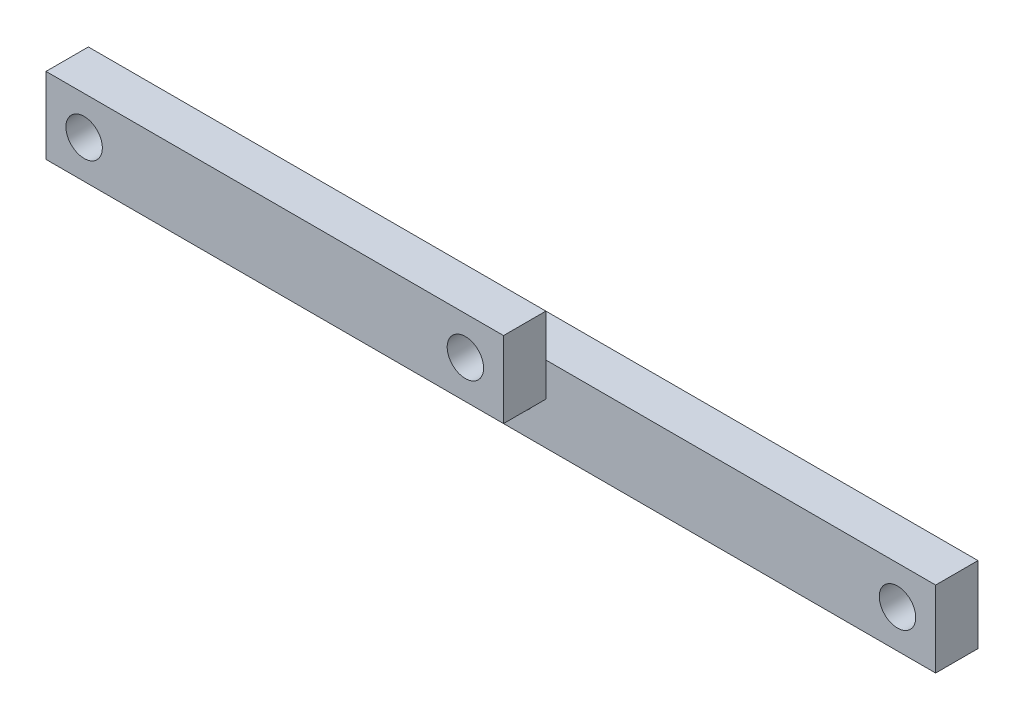
ISO-10303-21;
HEADER;
FILE_DESCRIPTION(('STEP AP214'),'2;1');
FILE_NAME('part.step','',(''),(''),'','','');
FILE_SCHEMA(('AUTOMOTIVE_DESIGN { 1 0 10303 214 1 1 1 1 }'));
ENDSEC;
DATA;
#1=APPLICATION_CONTEXT('core data for automotive mechanical design processes');
#2=APPLICATION_PROTOCOL_DEFINITION('international standard','automotive_design',2000,#1);
#3=PRODUCT_CONTEXT('',#1,'mechanical');
#4=PRODUCT('Part','Part','',(#3));
#5=PRODUCT_RELATED_PRODUCT_CATEGORY('part','',(#4));
#6=PRODUCT_DEFINITION_FORMATION('','',#4);
#7=PRODUCT_DEFINITION_CONTEXT('part definition',#1,'design');
#8=PRODUCT_DEFINITION('design','',#6,#7);
#9=PRODUCT_DEFINITION_SHAPE('','',#8);
#10=(LENGTH_UNIT() NAMED_UNIT(*) SI_UNIT(.MILLI.,.METRE.));
#11=(NAMED_UNIT(*) PLANE_ANGLE_UNIT() SI_UNIT($,.RADIAN.));
#12=(NAMED_UNIT(*) SI_UNIT($,.STERADIAN.) SOLID_ANGLE_UNIT());
#13=UNCERTAINTY_MEASURE_WITH_UNIT(LENGTH_MEASURE(1.E-05),#10,'distance_accuracy_value','');
#14=(GEOMETRIC_REPRESENTATION_CONTEXT(3) GLOBAL_UNCERTAINTY_ASSIGNED_CONTEXT((#13)) GLOBAL_UNIT_ASSIGNED_CONTEXT((#10,
#11,#12)) REPRESENTATION_CONTEXT('',''));
#15=CARTESIAN_POINT('',(0.,0.,0.));
#16=DIRECTION('',(0.,0.,1.));
#17=DIRECTION('',(1.,0.,0.));
#18=AXIS2_PLACEMENT_3D('',#15,#16,#17);
#19=CARTESIAN_POINT('',(-27.,-46.5,-46.));
#20=DIRECTION('',(-1.,0.,0.));
#21=DIRECTION('',(0.,0.,1.));
#22=AXIS2_PLACEMENT_3D('',#19,#20,#21);
#23=PLANE('',#22);
#24=DIRECTION('',(0.,1.,0.));
#25=VECTOR('',#24,1.);
#26=CARTESIAN_POINT('',(-27.,-46.5,-51.));
#27=LINE('',#26,#25);
#28=CARTESIAN_POINT('',(-27.,-55.5,-51.));
#29=VERTEX_POINT('',#28);
#30=CARTESIAN_POINT('',(-27.,-46.5,-51.));
#31=VERTEX_POINT('',#30);
#32=EDGE_CURVE('E120',#29,#31,#27,.T.);
#33=ORIENTED_EDGE('',*,*,#32,.F.);
#34=DIRECTION('',(0.,0.,-1.));
#35=VECTOR('',#34,1.);
#36=CARTESIAN_POINT('',(-27.,-55.5,-46.));
#37=LINE('',#36,#35);
#38=CARTESIAN_POINT('',(-27.,-55.5,-46.));
#39=VERTEX_POINT('',#38);
#40=EDGE_CURVE('E12',#39,#29,#37,.T.);
#41=ORIENTED_EDGE('',*,*,#40,.F.);
#42=DIRECTION('',(0.,1.,0.));
#43=VECTOR('',#42,1.);
#44=CARTESIAN_POINT('',(-27.,-46.5,-46.));
#45=LINE('',#44,#43);
#46=CARTESIAN_POINT('',(-27.,-46.5,-46.));
#47=VERTEX_POINT('',#46);
#48=EDGE_CURVE('E111',#39,#47,#45,.T.);
#49=ORIENTED_EDGE('',*,*,#48,.T.);
#50=DIRECTION('',(0.,0.,-1.));
#51=VECTOR('',#50,1.);
#52=CARTESIAN_POINT('',(-27.,-46.5,-46.));
#53=LINE('',#52,#51);
#54=EDGE_CURVE('E52',#47,#31,#53,.T.);
#55=ORIENTED_EDGE('',*,*,#54,.T.);
#56=EDGE_LOOP('',(#33,#41,#49,#55));
#57=FACE_BOUND('',#56,.T.);
#58=ADVANCED_FACE('F49',(#57),#23,.T.);
#59=CARTESIAN_POINT('',(27.,-55.5,-46.));
#60=DIRECTION('',(0.,-1.,0.));
#61=DIRECTION('',(0.,0.,-1.));
#62=AXIS2_PLACEMENT_3D('',#59,#60,#61);
#63=PLANE('',#62);
#64=DIRECTION('',(-1.,0.,0.));
#65=VECTOR('',#64,1.);
#66=CARTESIAN_POINT('',(27.,-55.5,-51.));
#67=LINE('',#66,#65);
#68=CARTESIAN_POINT('',(27.,-55.5,-51.));
#69=VERTEX_POINT('',#68);
#70=EDGE_CURVE('E114',#69,#29,#67,.T.);
#71=ORIENTED_EDGE('',*,*,#70,.F.);
#72=DIRECTION('',(0.,0.,-1.));
#73=VECTOR('',#72,1.);
#74=CARTESIAN_POINT('',(27.,-55.5,-46.));
#75=LINE('',#74,#73);
#76=CARTESIAN_POINT('',(27.,-55.5,-46.));
#77=VERTEX_POINT('',#76);
#78=EDGE_CURVE('E59',#77,#69,#75,.T.);
#79=ORIENTED_EDGE('',*,*,#78,.F.);
#80=DIRECTION('',(-1.,0.,0.));
#81=VECTOR('',#80,1.);
#82=CARTESIAN_POINT('',(27.,-55.5,-46.));
#83=LINE('',#82,#81);
#84=EDGE_CURVE('E106',#77,#39,#83,.T.);
#85=ORIENTED_EDGE('',*,*,#84,.T.);
#86=ORIENTED_EDGE('',*,*,#40,.T.);
#87=EDGE_LOOP('',(#71,#79,#85,#86));
#88=FACE_BOUND('',#87,.T.);
#89=ADVANCED_FACE('F137',(#88),#63,.T.);
#90=CARTESIAN_POINT('',(27.,-46.5,-46.));
#91=DIRECTION('',(1.,0.,0.));
#92=DIRECTION('',(0.,1.,0.));
#93=AXIS2_PLACEMENT_3D('',#90,#91,#92);
#94=PLANE('',#93);
#95=DIRECTION('',(0.,-1.,0.));
#96=VECTOR('',#95,1.);
#97=CARTESIAN_POINT('',(27.,-46.5,-51.));
#98=LINE('',#97,#96);
#99=CARTESIAN_POINT('',(27.,-46.5,-51.));
#100=VERTEX_POINT('',#99);
#101=EDGE_CURVE('E100',#100,#69,#98,.T.);
#102=ORIENTED_EDGE('',*,*,#101,.F.);
#103=DIRECTION('',(0.,0.,-1.));
#104=VECTOR('',#103,1.);
#105=CARTESIAN_POINT('',(27.,-46.5,-46.));
#106=LINE('',#105,#104);
#107=CARTESIAN_POINT('',(27.,-46.5,-46.));
#108=VERTEX_POINT('',#107);
#109=EDGE_CURVE('E95',#108,#100,#106,.T.);
#110=ORIENTED_EDGE('',*,*,#109,.F.);
#111=DIRECTION('',(0.,-1.,0.));
#112=VECTOR('',#111,1.);
#113=CARTESIAN_POINT('',(27.,-46.5,-46.));
#114=LINE('',#113,#112);
#115=EDGE_CURVE('E98',#108,#77,#114,.T.);
#116=ORIENTED_EDGE('',*,*,#115,.T.);
#117=ORIENTED_EDGE('',*,*,#78,.T.);
#118=EDGE_LOOP('',(#102,#110,#116,#117));
#119=FACE_BOUND('',#118,.T.);
#120=ADVANCED_FACE('F97',(#119),#94,.T.);
#121=CARTESIAN_POINT('',(27.,-46.5,-46.));
#122=DIRECTION('',(0.,1.,0.));
#123=DIRECTION('',(0.,0.,1.));
#124=AXIS2_PLACEMENT_3D('',#121,#122,#123);
#125=PLANE('',#124);
#126=DIRECTION('',(1.,0.,0.));
#127=VECTOR('',#126,1.);
#128=CARTESIAN_POINT('',(27.,-46.5,-51.));
#129=LINE('',#128,#127);
#130=EDGE_CURVE('E124',#31,#100,#129,.T.);
#131=ORIENTED_EDGE('',*,*,#130,.F.);
#132=ORIENTED_EDGE('',*,*,#54,.F.);
#133=DIRECTION('',(1.,0.,0.));
#134=VECTOR('',#133,1.);
#135=CARTESIAN_POINT('',(27.,-46.5,-46.));
#136=LINE('',#135,#134);
#137=EDGE_CURVE('E105',#47,#108,#136,.T.);
#138=ORIENTED_EDGE('',*,*,#137,.T.);
#139=ORIENTED_EDGE('',*,*,#109,.T.);
#140=EDGE_LOOP('',(#131,#132,#138,#139));
#141=FACE_BOUND('',#140,.T.);
#142=ADVANCED_FACE('F109',(#141),#125,.T.);
#143=CARTESIAN_POINT('',(0.,0.,-46.));
#144=DIRECTION('',(0.,0.,-1.));
#145=DIRECTION('',(-1.,0.,0.));
#146=AXIS2_PLACEMENT_3D('',#143,#144,#145);
#147=PLANE('',#146);
#148=CARTESIAN_POINT('',(-22.5,-51.,-46.));
#149=DIRECTION('',(0.,0.,-1.));
#150=DIRECTION('',(-1.,0.,0.));
#151=AXIS2_PLACEMENT_3D('',#148,#149,#150);
#152=CIRCLE('',#151,2.15);
#153=CARTESIAN_POINT('',(-20.35,-51.,-46.));
#154=VERTEX_POINT('',#153);
#155=EDGE_CURVE('E125',#154,#154,#152,.T.);
#156=ORIENTED_EDGE('',*,*,#155,.T.);
#157=EDGE_LOOP('',(#156));
#158=FACE_BOUND('',#157,.T.);
#159=CARTESIAN_POINT('',(22.5,-51.,-46.));
#160=DIRECTION('',(0.,0.,-1.));
#161=DIRECTION('',(-1.,0.,0.));
#162=AXIS2_PLACEMENT_3D('',#159,#160,#161);
#163=CIRCLE('',#162,2.15);
#164=CARTESIAN_POINT('',(24.65,-51.,-46.));
#165=VERTEX_POINT('',#164);
#166=EDGE_CURVE('E174',#165,#165,#163,.T.);
#167=ORIENTED_EDGE('',*,*,#166,.T.);
#168=EDGE_LOOP('',(#167));
#169=FACE_BOUND('',#168,.T.);
#170=ORIENTED_EDGE('',*,*,#48,.F.);
#171=ORIENTED_EDGE('',*,*,#84,.F.);
#172=ORIENTED_EDGE('',*,*,#115,.F.);
#173=ORIENTED_EDGE('',*,*,#137,.F.);
#174=EDGE_LOOP('',(#170,#171,#172,#173));
#175=FACE_BOUND('',#174,.T.);
#176=ADVANCED_FACE('F104',(#158,#169,#175),#147,.F.);
#177=CARTESIAN_POINT('',(0.,0.,-51.));
#178=DIRECTION('',(0.,0.,-1.));
#179=DIRECTION('',(-1.,0.,0.));
#180=AXIS2_PLACEMENT_3D('',#177,#178,#179);
#181=PLANE('',#180);
#182=CARTESIAN_POINT('',(-22.5,-51.,-51.));
#183=DIRECTION('',(0.,0.,1.));
#184=DIRECTION('',(1.,0.,0.));
#185=AXIS2_PLACEMENT_3D('',#182,#183,#184);
#186=CIRCLE('',#185,2.15);
#187=CARTESIAN_POINT('',(-20.35,-51.,-51.));
#188=VERTEX_POINT('',#187);
#189=EDGE_CURVE('E171',#188,#188,#186,.T.);
#190=ORIENTED_EDGE('',*,*,#189,.T.);
#191=EDGE_LOOP('',(#190));
#192=FACE_BOUND('',#191,.T.);
#193=CARTESIAN_POINT('',(22.5,-51.,-51.));
#194=DIRECTION('',(0.,0.,1.));
#195=DIRECTION('',(1.,0.,0.));
#196=AXIS2_PLACEMENT_3D('',#193,#194,#195);
#197=CIRCLE('',#196,2.15);
#198=CARTESIAN_POINT('',(24.65,-51.,-51.));
#199=VERTEX_POINT('',#198);
#200=EDGE_CURVE('E179',#199,#199,#197,.T.);
#201=ORIENTED_EDGE('',*,*,#200,.T.);
#202=EDGE_LOOP('',(#201));
#203=FACE_BOUND('',#202,.T.);
#204=ORIENTED_EDGE('',*,*,#32,.T.);
#205=ORIENTED_EDGE('',*,*,#130,.T.);
#206=ORIENTED_EDGE('',*,*,#101,.T.);
#207=ORIENTED_EDGE('',*,*,#70,.T.);
#208=EDGE_LOOP('',(#204,#205,#206,#207));
#209=FACE_BOUND('',#208,.T.);
#210=ADVANCED_FACE('F136',(#192,#203,#209),#181,.T.);
#211=CARTESIAN_POINT('',(22.5,-51.,-51.));
#212=DIRECTION('',(0.,0.,1.));
#213=DIRECTION('',(1.,0.,0.));
#214=AXIS2_PLACEMENT_3D('',#211,#212,#213);
#215=CYLINDRICAL_SURFACE('',#214,2.15);
#216=CARTESIAN_POINT('',(24.65,-51.,-51.));
#217=CARTESIAN_POINT('',(24.65,-51.,-50.9479166666667));
#218=CARTESIAN_POINT('',(24.65,-51.,-50.8958333333333));
#219=CARTESIAN_POINT('',(24.65,-51.,-50.7916666666667));
#220=CARTESIAN_POINT('',(24.65,-51.,-50.7395833333333));
#221=CARTESIAN_POINT('',(24.65,-51.,-50.6354166666667));
#222=CARTESIAN_POINT('',(24.65,-51.,-50.5833333333333));
#223=CARTESIAN_POINT('',(24.65,-51.,-50.4791666666667));
#224=CARTESIAN_POINT('',(24.65,-51.,-50.4270833333333));
#225=CARTESIAN_POINT('',(24.65,-51.,-50.3229166666667));
#226=CARTESIAN_POINT('',(24.65,-51.,-50.2708333333333));
#227=CARTESIAN_POINT('',(24.65,-51.,-50.1666666666667));
#228=CARTESIAN_POINT('',(24.65,-51.,-50.1145833333333));
#229=CARTESIAN_POINT('',(24.65,-51.,-50.0104166666667));
#230=CARTESIAN_POINT('',(24.65,-51.,-49.9583333333333));
#231=CARTESIAN_POINT('',(24.65,-51.,-49.8541666666667));
#232=CARTESIAN_POINT('',(24.65,-51.,-49.8020833333333));
#233=CARTESIAN_POINT('',(24.65,-51.,-49.6979166666667));
#234=CARTESIAN_POINT('',(24.65,-51.,-49.6458333333333));
#235=CARTESIAN_POINT('',(24.65,-51.,-49.5416666666667));
#236=CARTESIAN_POINT('',(24.65,-51.,-49.4895833333333));
#237=CARTESIAN_POINT('',(24.65,-51.,-49.3854166666667));
#238=CARTESIAN_POINT('',(24.65,-51.,-49.3333333333333));
#239=CARTESIAN_POINT('',(24.65,-51.,-49.2291666666667));
#240=CARTESIAN_POINT('',(24.65,-51.,-49.1770833333333));
#241=CARTESIAN_POINT('',(24.65,-51.,-49.0729166666667));
#242=CARTESIAN_POINT('',(24.65,-51.,-49.0208333333333));
#243=CARTESIAN_POINT('',(24.65,-51.,-48.9166666666667));
#244=CARTESIAN_POINT('',(24.65,-51.,-48.8645833333333));
#245=CARTESIAN_POINT('',(24.65,-51.,-48.7604166666667));
#246=CARTESIAN_POINT('',(24.65,-51.,-48.7083333333333));
#247=CARTESIAN_POINT('',(24.65,-51.,-48.6041666666667));
#248=CARTESIAN_POINT('',(24.65,-51.,-48.5520833333333));
#249=CARTESIAN_POINT('',(24.65,-51.,-48.4479166666667));
#250=CARTESIAN_POINT('',(24.65,-51.,-48.3958333333333));
#251=CARTESIAN_POINT('',(24.65,-51.,-48.2916666666667));
#252=CARTESIAN_POINT('',(24.65,-51.,-48.2395833333333));
#253=CARTESIAN_POINT('',(24.65,-51.,-48.1354166666667));
#254=CARTESIAN_POINT('',(24.65,-51.,-48.0833333333333));
#255=CARTESIAN_POINT('',(24.65,-51.,-47.9791666666667));
#256=CARTESIAN_POINT('',(24.65,-51.,-47.9270833333333));
#257=CARTESIAN_POINT('',(24.65,-51.,-47.8229166666667));
#258=CARTESIAN_POINT('',(24.65,-51.,-47.7708333333333));
#259=CARTESIAN_POINT('',(24.65,-51.,-47.6666666666667));
#260=CARTESIAN_POINT('',(24.65,-51.,-47.6145833333333));
#261=CARTESIAN_POINT('',(24.65,-51.,-47.5104166666667));
#262=CARTESIAN_POINT('',(24.65,-51.,-47.4583333333333));
#263=CARTESIAN_POINT('',(24.65,-51.,-47.3541666666667));
#264=CARTESIAN_POINT('',(24.65,-51.,-47.3020833333333));
#265=CARTESIAN_POINT('',(24.65,-51.,-47.1979166666667));
#266=CARTESIAN_POINT('',(24.65,-51.,-47.1458333333333));
#267=CARTESIAN_POINT('',(24.65,-51.,-47.0416666666667));
#268=CARTESIAN_POINT('',(24.65,-51.,-46.9895833333333));
#269=CARTESIAN_POINT('',(24.65,-51.,-46.8854166666667));
#270=CARTESIAN_POINT('',(24.65,-51.,-46.8333333333333));
#271=CARTESIAN_POINT('',(24.65,-51.,-46.7291666666667));
#272=CARTESIAN_POINT('',(24.65,-51.,-46.6770833333333));
#273=CARTESIAN_POINT('',(24.65,-51.,-46.5729166666667));
#274=CARTESIAN_POINT('',(24.65,-51.,-46.5208333333333));
#275=CARTESIAN_POINT('',(24.65,-51.,-46.4166666666667));
#276=CARTESIAN_POINT('',(24.65,-51.,-46.3645833333333));
#277=CARTESIAN_POINT('',(24.65,-51.,-46.2604166666667));
#278=CARTESIAN_POINT('',(24.65,-51.,-46.2083333333333));
#279=CARTESIAN_POINT('',(24.65,-51.,-46.1041666666667));
#280=CARTESIAN_POINT('',(24.65,-51.,-46.0520833333333));
#281=CARTESIAN_POINT('',(24.65,-51.,-46.));
#282=B_SPLINE_CURVE_WITH_KNOTS('',3,(#216,#217,#218,#219,#220,#221,#222,#223,#224,#225,#226,
#227,#228,#229,#230,#231,#232,#233,#234,#235,#236,#237,#238,#239,#240,#241,#242,#243,#244,#245,
#246,#247,#248,#249,#250,#251,#252,#253,#254,#255,#256,#257,#258,#259,#260,#261,#262,#263,#264,
#265,#266,#267,#268,#269,#270,#271,#272,#273,#274,#275,#276,#277,#278,#279,#280,#281),
.UNSPECIFIED.,.F.,.F.,(4,2,2,2,2,2,2,2,2,2,2,2,2,2,2,2,2,2,2,2,2,2,2,2,2,2,2,2,2,2,2,2,4),(0.,
0.156250000000004,0.312500000000007,0.468750000000004,0.625000000000008,0.781250000000004,
0.937500000000008,1.09375,1.25000000000001,1.40625,1.56250000000001,1.71875,1.87500000000001,
2.03125000000001,2.18750000000001,2.34375000000001,2.50000000000001,2.65625000000001,
2.81250000000001,2.96875000000001,3.12500000000001,3.28125000000001,3.43750000000001,
3.59375000000001,3.75000000000001,3.90625000000001,4.06250000000001,4.21875000000001,
4.37500000000001,4.53125000000001,4.68750000000001,4.84375000000001,5.00000000000001),.UNSPECIFIED.);
#283=EDGE_CURVE('BSEAM155',#199,#165,#282,.T.);
#284=ORIENTED_EDGE('',*,*,#200,.F.);
#285=ORIENTED_EDGE('',*,*,#166,.F.);
#286=ORIENTED_EDGE('',*,*,#283,.T.);
#287=ORIENTED_EDGE('',*,*,#283,.F.);
#288=EDGE_LOOP('',(#284,#286,#285,#287));
#289=FACE_BOUND('',#288,.T.);
#290=ADVANCED_FACE('F155',(#289),#215,.F.);
#291=CARTESIAN_POINT('',(-22.5,-51.,-51.));
#292=DIRECTION('',(0.,0.,1.));
#293=DIRECTION('',(1.,0.,0.));
#294=AXIS2_PLACEMENT_3D('',#291,#292,#293);
#295=CYLINDRICAL_SURFACE('',#294,2.15);
#296=CARTESIAN_POINT('',(-20.35,-51.,-51.));
#297=CARTESIAN_POINT('',(-20.35,-51.,-50.9479166666667));
#298=CARTESIAN_POINT('',(-20.35,-51.,-50.8958333333333));
#299=CARTESIAN_POINT('',(-20.35,-51.,-50.7916666666667));
#300=CARTESIAN_POINT('',(-20.35,-51.,-50.7395833333333));
#301=CARTESIAN_POINT('',(-20.35,-51.,-50.6354166666667));
#302=CARTESIAN_POINT('',(-20.35,-51.,-50.5833333333333));
#303=CARTESIAN_POINT('',(-20.35,-51.,-50.4791666666667));
#304=CARTESIAN_POINT('',(-20.35,-51.,-50.4270833333333));
#305=CARTESIAN_POINT('',(-20.35,-51.,-50.3229166666667));
#306=CARTESIAN_POINT('',(-20.35,-51.,-50.2708333333333));
#307=CARTESIAN_POINT('',(-20.35,-51.,-50.1666666666667));
#308=CARTESIAN_POINT('',(-20.35,-51.,-50.1145833333333));
#309=CARTESIAN_POINT('',(-20.35,-51.,-50.0104166666667));
#310=CARTESIAN_POINT('',(-20.35,-51.,-49.9583333333333));
#311=CARTESIAN_POINT('',(-20.35,-51.,-49.8541666666667));
#312=CARTESIAN_POINT('',(-20.35,-51.,-49.8020833333333));
#313=CARTESIAN_POINT('',(-20.35,-51.,-49.6979166666667));
#314=CARTESIAN_POINT('',(-20.35,-51.,-49.6458333333333));
#315=CARTESIAN_POINT('',(-20.35,-51.,-49.5416666666667));
#316=CARTESIAN_POINT('',(-20.35,-51.,-49.4895833333333));
#317=CARTESIAN_POINT('',(-20.35,-51.,-49.3854166666667));
#318=CARTESIAN_POINT('',(-20.35,-51.,-49.3333333333333));
#319=CARTESIAN_POINT('',(-20.35,-51.,-49.2291666666667));
#320=CARTESIAN_POINT('',(-20.35,-51.,-49.1770833333333));
#321=CARTESIAN_POINT('',(-20.35,-51.,-49.0729166666667));
#322=CARTESIAN_POINT('',(-20.35,-51.,-49.0208333333333));
#323=CARTESIAN_POINT('',(-20.35,-51.,-48.9166666666667));
#324=CARTESIAN_POINT('',(-20.35,-51.,-48.8645833333333));
#325=CARTESIAN_POINT('',(-20.35,-51.,-48.7604166666667));
#326=CARTESIAN_POINT('',(-20.35,-51.,-48.7083333333333));
#327=CARTESIAN_POINT('',(-20.35,-51.,-48.6041666666667));
#328=CARTESIAN_POINT('',(-20.35,-51.,-48.5520833333333));
#329=CARTESIAN_POINT('',(-20.35,-51.,-48.4479166666667));
#330=CARTESIAN_POINT('',(-20.35,-51.,-48.3958333333333));
#331=CARTESIAN_POINT('',(-20.35,-51.,-48.2916666666667));
#332=CARTESIAN_POINT('',(-20.35,-51.,-48.2395833333333));
#333=CARTESIAN_POINT('',(-20.35,-51.,-48.1354166666667));
#334=CARTESIAN_POINT('',(-20.35,-51.,-48.0833333333333));
#335=CARTESIAN_POINT('',(-20.35,-51.,-47.9791666666667));
#336=CARTESIAN_POINT('',(-20.35,-51.,-47.9270833333333));
#337=CARTESIAN_POINT('',(-20.35,-51.,-47.8229166666667));
#338=CARTESIAN_POINT('',(-20.35,-51.,-47.7708333333333));
#339=CARTESIAN_POINT('',(-20.35,-51.,-47.6666666666667));
#340=CARTESIAN_POINT('',(-20.35,-51.,-47.6145833333333));
#341=CARTESIAN_POINT('',(-20.35,-51.,-47.5104166666667));
#342=CARTESIAN_POINT('',(-20.35,-51.,-47.4583333333333));
#343=CARTESIAN_POINT('',(-20.35,-51.,-47.3541666666667));
#344=CARTESIAN_POINT('',(-20.35,-51.,-47.3020833333333));
#345=CARTESIAN_POINT('',(-20.35,-51.,-47.1979166666667));
#346=CARTESIAN_POINT('',(-20.35,-51.,-47.1458333333333));
#347=CARTESIAN_POINT('',(-20.35,-51.,-47.0416666666667));
#348=CARTESIAN_POINT('',(-20.35,-51.,-46.9895833333333));
#349=CARTESIAN_POINT('',(-20.35,-51.,-46.8854166666667));
#350=CARTESIAN_POINT('',(-20.35,-51.,-46.8333333333333));
#351=CARTESIAN_POINT('',(-20.35,-51.,-46.7291666666667));
#352=CARTESIAN_POINT('',(-20.35,-51.,-46.6770833333333));
#353=CARTESIAN_POINT('',(-20.35,-51.,-46.5729166666667));
#354=CARTESIAN_POINT('',(-20.35,-51.,-46.5208333333333));
#355=CARTESIAN_POINT('',(-20.35,-51.,-46.4166666666667));
#356=CARTESIAN_POINT('',(-20.35,-51.,-46.3645833333333));
#357=CARTESIAN_POINT('',(-20.35,-51.,-46.2604166666667));
#358=CARTESIAN_POINT('',(-20.35,-51.,-46.2083333333333));
#359=CARTESIAN_POINT('',(-20.35,-51.,-46.1041666666667));
#360=CARTESIAN_POINT('',(-20.35,-51.,-46.0520833333333));
#361=CARTESIAN_POINT('',(-20.35,-51.,-46.));
#362=B_SPLINE_CURVE_WITH_KNOTS('',3,(#296,#297,#298,#299,#300,#301,#302,#303,#304,#305,#306,
#307,#308,#309,#310,#311,#312,#313,#314,#315,#316,#317,#318,#319,#320,#321,#322,#323,#324,#325,
#326,#327,#328,#329,#330,#331,#332,#333,#334,#335,#336,#337,#338,#339,#340,#341,#342,#343,#344,
#345,#346,#347,#348,#349,#350,#351,#352,#353,#354,#355,#356,#357,#358,#359,#360,#361),
.UNSPECIFIED.,.F.,.F.,(4,2,2,2,2,2,2,2,2,2,2,2,2,2,2,2,2,2,2,2,2,2,2,2,2,2,2,2,2,2,2,2,4),(0.,
0.156250000000004,0.312500000000007,0.468750000000004,0.625000000000008,0.781250000000004,
0.937500000000008,1.09375,1.25000000000001,1.40625,1.56250000000001,1.71875,1.87500000000001,
2.03125000000001,2.18750000000001,2.34375000000001,2.50000000000001,2.65625000000001,
2.81250000000001,2.96875000000001,3.12500000000001,3.28125000000001,3.43750000000001,
3.59375000000001,3.75000000000001,3.90625000000001,4.06250000000001,4.21875000000001,
4.37500000000001,4.53125000000001,4.68750000000001,4.84375000000001,5.00000000000001),.UNSPECIFIED.);
#363=EDGE_CURVE('BSEAM162',#188,#154,#362,.T.);
#364=ORIENTED_EDGE('',*,*,#189,.F.);
#365=ORIENTED_EDGE('',*,*,#155,.F.);
#366=ORIENTED_EDGE('',*,*,#363,.T.);
#367=ORIENTED_EDGE('',*,*,#363,.F.);
#368=EDGE_LOOP('',(#364,#366,#365,#367));
#369=FACE_BOUND('',#368,.T.);
#370=ADVANCED_FACE('F162',(#369),#295,.F.);
#371=CLOSED_SHELL('',(#58,#89,#120,#142,#176,#210,#290,#370));
#372=MANIFOLD_SOLID_BREP('B2',#371);
#373=CARTESIAN_POINT('',(-27.,-4.5,5.));
#374=DIRECTION('',(-1.,0.,0.));
#375=DIRECTION('',(0.,0.,1.));
#376=AXIS2_PLACEMENT_3D('',#373,#374,#375);
#377=PLANE('',#376);
#378=DIRECTION('',(0.,1.,0.));
#379=VECTOR('',#378,1.);
#380=CARTESIAN_POINT('',(-27.,-4.5,0.));
#381=LINE('',#380,#379);
#382=CARTESIAN_POINT('',(-27.,-4.5,0.));
#383=VERTEX_POINT('',#382);
#384=CARTESIAN_POINT('',(-27.,4.5,0.));
#385=VERTEX_POINT('',#384);
#386=EDGE_CURVE('E299',#383,#385,#381,.T.);
#387=ORIENTED_EDGE('',*,*,#386,.F.);
#388=DIRECTION('',(0.,0.,-1.));
#389=VECTOR('',#388,1.);
#390=CARTESIAN_POINT('',(-27.,-4.5,5.));
#391=LINE('',#390,#389);
#392=CARTESIAN_POINT('',(-27.,-4.5,5.));
#393=VERTEX_POINT('',#392);
#394=EDGE_CURVE('E47',#393,#383,#391,.T.);
#395=ORIENTED_EDGE('',*,*,#394,.F.);
#396=DIRECTION('',(0.,1.,0.));
#397=VECTOR('',#396,1.);
#398=CARTESIAN_POINT('',(-27.,-4.5,5.));
#399=LINE('',#398,#397);
#400=CARTESIAN_POINT('',(-27.,4.5,5.));
#401=VERTEX_POINT('',#400);
#402=EDGE_CURVE('E293',#393,#401,#399,.T.);
#403=ORIENTED_EDGE('',*,*,#402,.T.);
#404=DIRECTION('',(0.,0.,-1.));
#405=VECTOR('',#404,1.);
#406=CARTESIAN_POINT('',(-27.,4.5,5.));
#407=LINE('',#406,#405);
#408=EDGE_CURVE('E272',#401,#385,#407,.T.);
#409=ORIENTED_EDGE('',*,*,#408,.T.);
#410=EDGE_LOOP('',(#387,#395,#403,#409));
#411=FACE_BOUND('',#410,.T.);
#412=ADVANCED_FACE('F231',(#411),#377,.T.);
#413=CARTESIAN_POINT('',(-27.,-4.5,5.));
#414=DIRECTION('',(0.,1.,0.));
#415=DIRECTION('',(0.,0.,1.));
#416=AXIS2_PLACEMENT_3D('',#413,#414,#415);
#417=PLANE('',#416);
#418=DIRECTION('',(1.,0.,0.));
#419=VECTOR('',#418,1.);
#420=CARTESIAN_POINT('',(-27.,-4.5,0.));
#421=LINE('',#420,#419);
#422=CARTESIAN_POINT('',(27.,-4.5,0.));
#423=VERTEX_POINT('',#422);
#424=EDGE_CURVE('E264',#383,#423,#421,.T.);
#425=ORIENTED_EDGE('',*,*,#424,.T.);
#426=DIRECTION('',(0.,0.,-1.));
#427=VECTOR('',#426,1.);
#428=CARTESIAN_POINT('',(27.,-4.5,5.));
#429=LINE('',#428,#427);
#430=CARTESIAN_POINT('',(27.,-4.5,5.));
#431=VERTEX_POINT('',#430);
#432=EDGE_CURVE('E240',#431,#423,#429,.T.);
#433=ORIENTED_EDGE('',*,*,#432,.F.);
#434=DIRECTION('',(1.,0.,0.));
#435=VECTOR('',#434,1.);
#436=CARTESIAN_POINT('',(-27.,-4.5,5.));
#437=LINE('',#436,#435);
#438=EDGE_CURVE('E282',#393,#431,#437,.T.);
#439=ORIENTED_EDGE('',*,*,#438,.F.);
#440=ORIENTED_EDGE('',*,*,#394,.T.);
#441=EDGE_LOOP('',(#425,#433,#439,#440));
#442=FACE_BOUND('',#441,.T.);
#443=ADVANCED_FACE('F333',(#442),#417,.F.);
#444=CARTESIAN_POINT('',(27.,-4.5,5.));
#445=DIRECTION('',(-1.,0.,0.));
#446=DIRECTION('',(0.,-1.,0.));
#447=AXIS2_PLACEMENT_3D('',#444,#445,#446);
#448=PLANE('',#447);
#449=DIRECTION('',(0.,1.,0.));
#450=VECTOR('',#449,1.);
#451=CARTESIAN_POINT('',(27.,-4.5,0.));
#452=LINE('',#451,#450);
#453=CARTESIAN_POINT('',(27.,4.5,0.));
#454=VERTEX_POINT('',#453);
#455=EDGE_CURVE('E289',#423,#454,#452,.T.);
#456=ORIENTED_EDGE('',*,*,#455,.T.);
#457=DIRECTION('',(0.,0.,-1.));
#458=VECTOR('',#457,1.);
#459=CARTESIAN_POINT('',(27.,4.5,5.));
#460=LINE('',#459,#458);
#461=CARTESIAN_POINT('',(27.,4.5,5.));
#462=VERTEX_POINT('',#461);
#463=EDGE_CURVE('E286',#462,#454,#460,.T.);
#464=ORIENTED_EDGE('',*,*,#463,.F.);
#465=DIRECTION('',(0.,1.,0.));
#466=VECTOR('',#465,1.);
#467=CARTESIAN_POINT('',(27.,-4.5,5.));
#468=LINE('',#467,#466);
#469=EDGE_CURVE('E277',#431,#462,#468,.T.);
#470=ORIENTED_EDGE('',*,*,#469,.F.);
#471=ORIENTED_EDGE('',*,*,#432,.T.);
#472=EDGE_LOOP('',(#456,#464,#470,#471));
#473=FACE_BOUND('',#472,.T.);
#474=ADVANCED_FACE('F287',(#473),#448,.F.);
#475=CARTESIAN_POINT('',(-27.,4.5,5.));
#476=DIRECTION('',(0.,1.,0.));
#477=DIRECTION('',(0.,0.,1.));
#478=AXIS2_PLACEMENT_3D('',#475,#476,#477);
#479=PLANE('',#478);
#480=DIRECTION('',(1.,0.,0.));
#481=VECTOR('',#480,1.);
#482=CARTESIAN_POINT('',(-27.,4.5,0.));
#483=LINE('',#482,#481);
#484=EDGE_CURVE('E302',#385,#454,#483,.T.);
#485=ORIENTED_EDGE('',*,*,#484,.F.);
#486=ORIENTED_EDGE('',*,*,#408,.F.);
#487=DIRECTION('',(1.,0.,0.));
#488=VECTOR('',#487,1.);
#489=CARTESIAN_POINT('',(-27.,4.5,5.));
#490=LINE('',#489,#488);
#491=EDGE_CURVE('E281',#401,#462,#490,.T.);
#492=ORIENTED_EDGE('',*,*,#491,.T.);
#493=ORIENTED_EDGE('',*,*,#463,.T.);
#494=EDGE_LOOP('',(#485,#486,#492,#493));
#495=FACE_BOUND('',#494,.T.);
#496=ADVANCED_FACE('F292',(#495),#479,.T.);
#497=CARTESIAN_POINT('',(0.,0.,5.));
#498=DIRECTION('',(0.,0.,-1.));
#499=DIRECTION('',(-1.,0.,0.));
#500=AXIS2_PLACEMENT_3D('',#497,#498,#499);
#501=PLANE('',#500);
#502=CARTESIAN_POINT('',(22.5,0.,5.));
#503=DIRECTION('',(0.,0.,-1.));
#504=DIRECTION('',(-1.,0.,0.));
#505=AXIS2_PLACEMENT_3D('',#502,#503,#504);
#506=CIRCLE('',#505,2.15);
#507=CARTESIAN_POINT('',(24.65,0.,5.));
#508=VERTEX_POINT('',#507);
#509=EDGE_CURVE('E303',#508,#508,#506,.T.);
#510=ORIENTED_EDGE('',*,*,#509,.T.);
#511=EDGE_LOOP('',(#510));
#512=FACE_BOUND('',#511,.T.);
#513=CARTESIAN_POINT('',(-22.5,0.,5.));
#514=DIRECTION('',(0.,0.,-1.));
#515=DIRECTION('',(-1.,0.,0.));
#516=AXIS2_PLACEMENT_3D('',#513,#514,#515);
#517=CIRCLE('',#516,2.15);
#518=CARTESIAN_POINT('',(-20.35,0.,5.));
#519=VERTEX_POINT('',#518);
#520=EDGE_CURVE('E310',#519,#519,#517,.T.);
#521=ORIENTED_EDGE('',*,*,#520,.T.);
#522=EDGE_LOOP('',(#521));
#523=FACE_BOUND('',#522,.T.);
#524=ORIENTED_EDGE('',*,*,#402,.F.);
#525=ORIENTED_EDGE('',*,*,#438,.T.);
#526=ORIENTED_EDGE('',*,*,#469,.T.);
#527=ORIENTED_EDGE('',*,*,#491,.F.);
#528=EDGE_LOOP('',(#524,#525,#526,#527));
#529=FACE_BOUND('',#528,.T.);
#530=ADVANCED_FACE('F280',(#512,#523,#529),#501,.F.);
#531=CARTESIAN_POINT('',(0.,0.,0.));
#532=DIRECTION('',(0.,0.,-1.));
#533=DIRECTION('',(-1.,0.,0.));
#534=AXIS2_PLACEMENT_3D('',#531,#532,#533);
#535=PLANE('',#534);
#536=CARTESIAN_POINT('',(22.5,0.,0.));
#537=DIRECTION('',(0.,0.,-1.));
#538=DIRECTION('',(-1.,0.,0.));
#539=AXIS2_PLACEMENT_3D('',#536,#537,#538);
#540=CIRCLE('',#539,2.15);
#541=CARTESIAN_POINT('',(24.65,0.,0.));
#542=VERTEX_POINT('',#541);
#543=EDGE_CURVE('E234',#542,#542,#540,.T.);
#544=ORIENTED_EDGE('',*,*,#543,.F.);
#545=EDGE_LOOP('',(#544));
#546=FACE_BOUND('',#545,.T.);
#547=CARTESIAN_POINT('',(-22.5,0.,0.));
#548=DIRECTION('',(0.,0.,-1.));
#549=DIRECTION('',(-1.,0.,0.));
#550=AXIS2_PLACEMENT_3D('',#547,#548,#549);
#551=CIRCLE('',#550,2.15);
#552=CARTESIAN_POINT('',(-20.35,0.,0.));
#553=VERTEX_POINT('',#552);
#554=EDGE_CURVE('E308',#553,#553,#551,.T.);
#555=ORIENTED_EDGE('',*,*,#554,.F.);
#556=EDGE_LOOP('',(#555));
#557=FACE_BOUND('',#556,.T.);
#558=ORIENTED_EDGE('',*,*,#386,.T.);
#559=ORIENTED_EDGE('',*,*,#484,.T.);
#560=ORIENTED_EDGE('',*,*,#455,.F.);
#561=ORIENTED_EDGE('',*,*,#424,.F.);
#562=EDGE_LOOP('',(#558,#559,#560,#561));
#563=FACE_BOUND('',#562,.T.);
#564=ADVANCED_FACE('F330',(#546,#557,#563),#535,.T.);
#565=CARTESIAN_POINT('',(-22.5,0.,-51.));
#566=DIRECTION('',(0.,0.,1.));
#567=DIRECTION('',(1.,0.,0.));
#568=AXIS2_PLACEMENT_3D('',#565,#566,#567);
#569=CYLINDRICAL_SURFACE('',#568,2.15);
#570=CARTESIAN_POINT('',(-20.35,0.,0.));
#571=CARTESIAN_POINT('',(-20.35,0.,0.0520833333333322));
#572=CARTESIAN_POINT('',(-20.35,0.,0.104166666666664));
#573=CARTESIAN_POINT('',(-20.35,0.,0.208333333333331));
#574=CARTESIAN_POINT('',(-20.35,0.,0.260416666666666));
#575=CARTESIAN_POINT('',(-20.35,0.,0.364583333333335));
#576=CARTESIAN_POINT('',(-20.35,0.,0.416666666666669));
#577=CARTESIAN_POINT('',(-20.35,0.,0.520833333333336));
#578=CARTESIAN_POINT('',(-20.35,0.,0.572916666666668));
#579=CARTESIAN_POINT('',(-20.35,0.,0.677083333333333));
#580=CARTESIAN_POINT('',(-20.35,0.,0.729166666666665));
#581=CARTESIAN_POINT('',(-20.35,0.,0.833333333333332));
#582=CARTESIAN_POINT('',(-20.35,0.,0.885416666666666));
#583=CARTESIAN_POINT('',(-20.35,0.,0.989583333333335));
#584=CARTESIAN_POINT('',(-20.35,0.,1.04166666666667));
#585=CARTESIAN_POINT('',(-20.35,0.,1.14583333333334));
#586=CARTESIAN_POINT('',(-20.35,0.,1.19791666666667));
#587=CARTESIAN_POINT('',(-20.35,0.,1.30208333333333));
#588=CARTESIAN_POINT('',(-20.35,0.,1.35416666666667));
#589=CARTESIAN_POINT('',(-20.35,0.,1.45833333333333));
#590=CARTESIAN_POINT('',(-20.35,0.,1.51041666666667));
#591=CARTESIAN_POINT('',(-20.35,0.,1.61458333333334));
#592=CARTESIAN_POINT('',(-20.35,0.,1.66666666666667));
#593=CARTESIAN_POINT('',(-20.35,0.,1.77083333333334));
#594=CARTESIAN_POINT('',(-20.35,0.,1.82291666666667));
#595=CARTESIAN_POINT('',(-20.35,0.,1.92708333333333));
#596=CARTESIAN_POINT('',(-20.35,0.,1.97916666666667));
#597=CARTESIAN_POINT('',(-20.35,0.,2.08333333333333));
#598=CARTESIAN_POINT('',(-20.35,0.,2.13541666666667));
#599=CARTESIAN_POINT('',(-20.35,0.,2.23958333333334));
#600=CARTESIAN_POINT('',(-20.35,0.,2.29166666666667));
#601=CARTESIAN_POINT('',(-20.35,0.,2.39583333333334));
#602=CARTESIAN_POINT('',(-20.35,0.,2.44791666666667));
#603=CARTESIAN_POINT('',(-20.35,0.,2.55208333333333));
#604=CARTESIAN_POINT('',(-20.35,0.,2.60416666666667));
#605=CARTESIAN_POINT('',(-20.35,0.,2.70833333333333));
#606=CARTESIAN_POINT('',(-20.35,0.,2.76041666666667));
#607=CARTESIAN_POINT('',(-20.35,0.,2.86458333333334));
#608=CARTESIAN_POINT('',(-20.35,0.,2.91666666666667));
#609=CARTESIAN_POINT('',(-20.35,0.,3.02083333333334));
#610=CARTESIAN_POINT('',(-20.35,0.,3.07291666666667));
#611=CARTESIAN_POINT('',(-20.35,0.,3.17708333333334));
#612=CARTESIAN_POINT('',(-20.35,0.,3.22916666666667));
#613=CARTESIAN_POINT('',(-20.35,0.,3.33333333333333));
#614=CARTESIAN_POINT('',(-20.35,0.,3.38541666666667));
#615=CARTESIAN_POINT('',(-20.35,0.,3.48958333333334));
#616=CARTESIAN_POINT('',(-20.35,0.,3.54166666666667));
#617=CARTESIAN_POINT('',(-20.35,0.,3.64583333333334));
#618=CARTESIAN_POINT('',(-20.35,0.,3.69791666666667));
#619=CARTESIAN_POINT('',(-20.35,0.,3.80208333333334));
#620=CARTESIAN_POINT('',(-20.35,0.,3.85416666666667));
#621=CARTESIAN_POINT('',(-20.35,0.,3.95833333333333));
#622=CARTESIAN_POINT('',(-20.35,0.,4.01041666666667));
#623=CARTESIAN_POINT('',(-20.35,0.,4.11458333333334));
#624=CARTESIAN_POINT('',(-20.35,0.,4.16666666666667));
#625=CARTESIAN_POINT('',(-20.35,0.,4.27083333333334));
#626=CARTESIAN_POINT('',(-20.35,0.,4.32291666666667));
#627=CARTESIAN_POINT('',(-20.35,0.,4.42708333333334));
#628=CARTESIAN_POINT('',(-20.35,0.,4.47916666666667));
#629=CARTESIAN_POINT('',(-20.35,0.,4.58333333333333));
#630=CARTESIAN_POINT('',(-20.35,0.,4.63541666666667));
#631=CARTESIAN_POINT('',(-20.35,0.,4.73958333333334));
#632=CARTESIAN_POINT('',(-20.35,0.,4.79166666666667));
#633=CARTESIAN_POINT('',(-20.35,0.,4.89583333333334));
#634=CARTESIAN_POINT('',(-20.35,0.,4.94791666666667));
#635=CARTESIAN_POINT('',(-20.35,0.,5.));
#636=B_SPLINE_CURVE_WITH_KNOTS('',3,(#570,#571,#572,#573,#574,#575,#576,#577,#578,#579,#580,
#581,#582,#583,#584,#585,#586,#587,#588,#589,#590,#591,#592,#593,#594,#595,#596,#597,#598,#599,
#600,#601,#602,#603,#604,#605,#606,#607,#608,#609,#610,#611,#612,#613,#614,#615,#616,#617,#618,
#619,#620,#621,#622,#623,#624,#625,#626,#627,#628,#629,#630,#631,#632,#633,#634,#635),
.UNSPECIFIED.,.F.,.F.,(4,2,2,2,2,2,2,2,2,2,2,2,2,2,2,2,2,2,2,2,2,2,2,2,2,2,2,2,2,2,2,2,4),(0.,
0.156249999999997,0.3125,0.468750000000004,0.625000000000001,0.781249999999997,
0.937500000000001,1.09375,1.25,1.40625,1.5625,1.71875,1.875,2.03125,2.1875,2.34375000000001,2.5,
2.65625,2.8125,2.96875000000001,3.125,3.28125,3.4375,3.59375000000001,3.75,3.90625,4.0625,
4.21875000000001,4.375,4.53125,4.6875,4.84375000000001,5.),.UNSPECIFIED.);
#637=EDGE_CURVE('BSEAM324',#553,#519,#636,.T.);
#638=ORIENTED_EDGE('',*,*,#554,.T.);
#639=ORIENTED_EDGE('',*,*,#520,.F.);
#640=ORIENTED_EDGE('',*,*,#637,.T.);
#641=ORIENTED_EDGE('',*,*,#637,.F.);
#642=EDGE_LOOP('',(#638,#640,#639,#641));
#643=FACE_BOUND('',#642,.T.);
#644=ADVANCED_FACE('F324',(#643),#569,.F.);
#645=CARTESIAN_POINT('',(22.5,0.,-51.));
#646=DIRECTION('',(0.,0.,1.));
#647=DIRECTION('',(1.,0.,0.));
#648=AXIS2_PLACEMENT_3D('',#645,#646,#647);
#649=CYLINDRICAL_SURFACE('',#648,2.15);
#650=CARTESIAN_POINT('',(24.65,0.,0.));
#651=CARTESIAN_POINT('',(24.65,0.,0.0520833333333322));
#652=CARTESIAN_POINT('',(24.65,0.,0.104166666666664));
#653=CARTESIAN_POINT('',(24.65,0.,0.208333333333331));
#654=CARTESIAN_POINT('',(24.65,0.,0.260416666666666));
#655=CARTESIAN_POINT('',(24.65,0.,0.364583333333335));
#656=CARTESIAN_POINT('',(24.65,0.,0.416666666666669));
#657=CARTESIAN_POINT('',(24.65,0.,0.520833333333336));
#658=CARTESIAN_POINT('',(24.65,0.,0.572916666666668));
#659=CARTESIAN_POINT('',(24.65,0.,0.677083333333333));
#660=CARTESIAN_POINT('',(24.65,0.,0.729166666666665));
#661=CARTESIAN_POINT('',(24.65,0.,0.833333333333332));
#662=CARTESIAN_POINT('',(24.65,0.,0.885416666666666));
#663=CARTESIAN_POINT('',(24.65,0.,0.989583333333335));
#664=CARTESIAN_POINT('',(24.65,0.,1.04166666666667));
#665=CARTESIAN_POINT('',(24.65,0.,1.14583333333334));
#666=CARTESIAN_POINT('',(24.65,0.,1.19791666666667));
#667=CARTESIAN_POINT('',(24.65,0.,1.30208333333333));
#668=CARTESIAN_POINT('',(24.65,0.,1.35416666666667));
#669=CARTESIAN_POINT('',(24.65,0.,1.45833333333333));
#670=CARTESIAN_POINT('',(24.65,0.,1.51041666666667));
#671=CARTESIAN_POINT('',(24.65,0.,1.61458333333334));
#672=CARTESIAN_POINT('',(24.65,0.,1.66666666666667));
#673=CARTESIAN_POINT('',(24.65,0.,1.77083333333334));
#674=CARTESIAN_POINT('',(24.65,0.,1.82291666666667));
#675=CARTESIAN_POINT('',(24.65,0.,1.92708333333333));
#676=CARTESIAN_POINT('',(24.65,0.,1.97916666666667));
#677=CARTESIAN_POINT('',(24.65,0.,2.08333333333333));
#678=CARTESIAN_POINT('',(24.65,0.,2.13541666666667));
#679=CARTESIAN_POINT('',(24.65,0.,2.23958333333334));
#680=CARTESIAN_POINT('',(24.65,0.,2.29166666666667));
#681=CARTESIAN_POINT('',(24.65,0.,2.39583333333334));
#682=CARTESIAN_POINT('',(24.65,0.,2.44791666666667));
#683=CARTESIAN_POINT('',(24.65,0.,2.55208333333333));
#684=CARTESIAN_POINT('',(24.65,0.,2.60416666666667));
#685=CARTESIAN_POINT('',(24.65,0.,2.70833333333333));
#686=CARTESIAN_POINT('',(24.65,0.,2.76041666666667));
#687=CARTESIAN_POINT('',(24.65,0.,2.86458333333334));
#688=CARTESIAN_POINT('',(24.65,0.,2.91666666666667));
#689=CARTESIAN_POINT('',(24.65,0.,3.02083333333334));
#690=CARTESIAN_POINT('',(24.65,0.,3.07291666666667));
#691=CARTESIAN_POINT('',(24.65,0.,3.17708333333334));
#692=CARTESIAN_POINT('',(24.65,0.,3.22916666666667));
#693=CARTESIAN_POINT('',(24.65,0.,3.33333333333333));
#694=CARTESIAN_POINT('',(24.65,0.,3.38541666666667));
#695=CARTESIAN_POINT('',(24.65,0.,3.48958333333334));
#696=CARTESIAN_POINT('',(24.65,0.,3.54166666666667));
#697=CARTESIAN_POINT('',(24.65,0.,3.64583333333334));
#698=CARTESIAN_POINT('',(24.65,0.,3.69791666666667));
#699=CARTESIAN_POINT('',(24.65,0.,3.80208333333334));
#700=CARTESIAN_POINT('',(24.65,0.,3.85416666666667));
#701=CARTESIAN_POINT('',(24.65,0.,3.95833333333333));
#702=CARTESIAN_POINT('',(24.65,0.,4.01041666666667));
#703=CARTESIAN_POINT('',(24.65,0.,4.11458333333334));
#704=CARTESIAN_POINT('',(24.65,0.,4.16666666666667));
#705=CARTESIAN_POINT('',(24.65,0.,4.27083333333334));
#706=CARTESIAN_POINT('',(24.65,0.,4.32291666666667));
#707=CARTESIAN_POINT('',(24.65,0.,4.42708333333334));
#708=CARTESIAN_POINT('',(24.65,0.,4.47916666666667));
#709=CARTESIAN_POINT('',(24.65,0.,4.58333333333333));
#710=CARTESIAN_POINT('',(24.65,0.,4.63541666666667));
#711=CARTESIAN_POINT('',(24.65,0.,4.73958333333334));
#712=CARTESIAN_POINT('',(24.65,0.,4.79166666666667));
#713=CARTESIAN_POINT('',(24.65,0.,4.89583333333334));
#714=CARTESIAN_POINT('',(24.65,0.,4.94791666666667));
#715=CARTESIAN_POINT('',(24.65,0.,5.));
#716=B_SPLINE_CURVE_WITH_KNOTS('',3,(#650,#651,#652,#653,#654,#655,#656,#657,#658,#659,#660,
#661,#662,#663,#664,#665,#666,#667,#668,#669,#670,#671,#672,#673,#674,#675,#676,#677,#678,#679,
#680,#681,#682,#683,#684,#685,#686,#687,#688,#689,#690,#691,#692,#693,#694,#695,#696,#697,#698,
#699,#700,#701,#702,#703,#704,#705,#706,#707,#708,#709,#710,#711,#712,#713,#714,#715),
.UNSPECIFIED.,.F.,.F.,(4,2,2,2,2,2,2,2,2,2,2,2,2,2,2,2,2,2,2,2,2,2,2,2,2,2,2,2,2,2,2,2,4),(0.,
0.156249999999997,0.3125,0.468750000000004,0.625000000000001,0.781249999999997,
0.937500000000001,1.09375,1.25,1.40625,1.5625,1.71875,1.875,2.03125,2.1875,2.34375000000001,2.5,
2.65625,2.8125,2.96875000000001,3.125,3.28125,3.4375,3.59375000000001,3.75,3.90625,4.0625,
4.21875000000001,4.375,4.53125,4.6875,4.84375000000001,5.),.UNSPECIFIED.);
#717=EDGE_CURVE('BSEAM322',#542,#508,#716,.T.);
#718=ORIENTED_EDGE('',*,*,#543,.T.);
#719=ORIENTED_EDGE('',*,*,#509,.F.);
#720=ORIENTED_EDGE('',*,*,#717,.T.);
#721=ORIENTED_EDGE('',*,*,#717,.F.);
#722=EDGE_LOOP('',(#718,#720,#719,#721));
#723=FACE_BOUND('',#722,.T.);
#724=ADVANCED_FACE('F322',(#723),#649,.F.);
#725=CLOSED_SHELL('',(#412,#443,#474,#496,#530,#564,#644,#724));
#726=MANIFOLD_SOLID_BREP('B6',#725);
#727=ADVANCED_BREP_SHAPE_REPRESENTATION('',(#18,#372,#726),#14);
#728=SHAPE_DEFINITION_REPRESENTATION(#9,#727);
ENDSEC;
END-ISO-10303-21;
